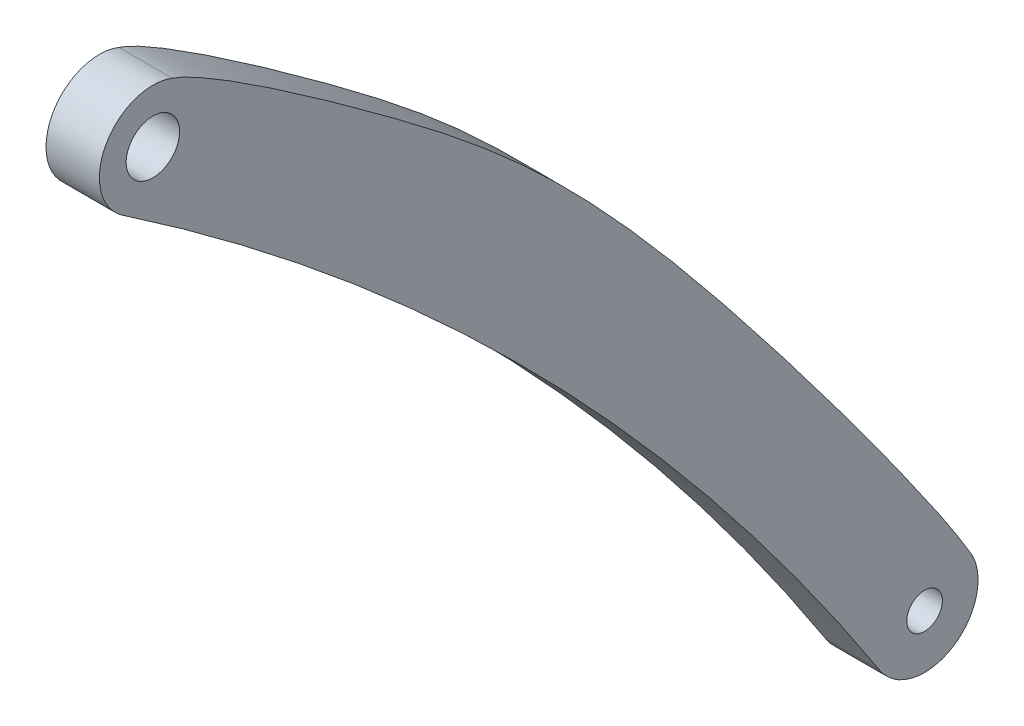
ISO-10303-21;
HEADER;
FILE_DESCRIPTION(('STEP AP214'),'2;1');
FILE_NAME('part.step','',(''),(''),'','','');
FILE_SCHEMA(('AUTOMOTIVE_DESIGN { 1 0 10303 214 1 1 1 1 }'));
ENDSEC;
DATA;
#1=APPLICATION_CONTEXT('core data for automotive mechanical design processes');
#2=APPLICATION_PROTOCOL_DEFINITION('international standard','automotive_design',2000,#1);
#3=PRODUCT_CONTEXT('',#1,'mechanical');
#4=PRODUCT('Part','Part','',(#3));
#5=PRODUCT_RELATED_PRODUCT_CATEGORY('part','',(#4));
#6=PRODUCT_DEFINITION_FORMATION('','',#4);
#7=PRODUCT_DEFINITION_CONTEXT('part definition',#1,'design');
#8=PRODUCT_DEFINITION('design','',#6,#7);
#9=PRODUCT_DEFINITION_SHAPE('','',#8);
#10=(LENGTH_UNIT() NAMED_UNIT(*) SI_UNIT(.MILLI.,.METRE.));
#11=(NAMED_UNIT(*) PLANE_ANGLE_UNIT() SI_UNIT($,.RADIAN.));
#12=(NAMED_UNIT(*) SI_UNIT($,.STERADIAN.) SOLID_ANGLE_UNIT());
#13=UNCERTAINTY_MEASURE_WITH_UNIT(LENGTH_MEASURE(1.E-05),#10,'distance_accuracy_value','');
#14=(GEOMETRIC_REPRESENTATION_CONTEXT(3) GLOBAL_UNCERTAINTY_ASSIGNED_CONTEXT((#13)) GLOBAL_UNIT_ASSIGNED_CONTEXT((#10,
#11,#12)) REPRESENTATION_CONTEXT('',''));
#15=CARTESIAN_POINT('',(0.,0.,0.));
#16=DIRECTION('',(0.,0.,1.));
#17=DIRECTION('',(1.,0.,0.));
#18=AXIS2_PLACEMENT_3D('',#15,#16,#17);
#19=CARTESIAN_POINT('',(4.5,-106.955102548607,-76.1129421232263));
#20=DIRECTION('',(1.,0.,0.));
#21=DIRECTION('',(0.,0.,-1.));
#22=AXIS2_PLACEMENT_3D('',#19,#20,#21);
#23=PLANE('',#22);
#24=CARTESIAN_POINT('',(4.5,149.063106318682,121.853777677032));
#25=DIRECTION('',(1.,0.,0.));
#26=DIRECTION('',(0.,0.,-1.));
#27=AXIS2_PLACEMENT_3D('',#24,#25,#26);
#28=CIRCLE('',#27,2.99999999999999);
#29=CARTESIAN_POINT('',(4.5,149.063106318682,118.853777677032));
#30=VERTEX_POINT('',#29);
#31=EDGE_CURVE('E12',#30,#30,#28,.T.);
#32=ORIENTED_EDGE('',*,*,#31,.F.);
#33=EDGE_LOOP('',(#32));
#34=FACE_BOUND('',#33,.T.);
#35=CARTESIAN_POINT('',(4.5,60.6344164774871,35.2119470582724));
#36=DIRECTION('',(1.,0.,0.));
#37=DIRECTION('',(0.,0.,-1.));
#38=AXIS2_PLACEMENT_3D('',#35,#36,#37);
#39=CIRCLE('',#38,2.);
#40=CARTESIAN_POINT('',(4.5,60.6344164774871,33.2119470582724));
#41=VERTEX_POINT('',#40);
#42=EDGE_CURVE('E59',#41,#41,#39,.T.);
#43=ORIENTED_EDGE('',*,*,#42,.F.);
#44=EDGE_LOOP('',(#43));
#45=FACE_BOUND('',#44,.T.);
#46=CARTESIAN_POINT('',(4.5,57.3746119648548,40.2491759134489));
#47=CARTESIAN_POINT('',(4.5,56.3855919492086,39.609139099006));
#48=CARTESIAN_POINT('',(4.5,55.7116981336144,38.642230444073));
#49=CARTESIAN_POINT('',(4.5,55.0382488465093,37.6759596024477));
#50=CARTESIAN_POINT('',(4.5,54.7800207680061,36.5257396129822));
#51=CARTESIAN_POINT('',(4.5,54.5220226928645,35.3765441227334));
#52=CARTESIAN_POINT('',(4.5,54.7179742299143,34.2140937969478));
#53=CARTESIAN_POINT('',(4.5,54.9137512332307,33.0526788638841));
#54=CARTESIAN_POINT('',(4.5,55.5347751122964,32.0506723238598));
#55=CARTESIAN_POINT('',(4.5,56.1552458464256,31.0495582693945));
#56=CARTESIAN_POINT('',(4.5,57.1090931767279,30.3568367994705));
#57=CARTESIAN_POINT('',(4.5,58.0620909168114,29.6647323353988));
#58=CARTESIAN_POINT('',(4.5,59.2070741384824,29.3841950176238));
#59=CARTESIAN_POINT('',(4.5,60.3510375254185,29.1039075739915));
#60=CARTESIAN_POINT('',(4.5,61.5170771365007,29.2772263267611));
#61=CARTESIAN_POINT('',(4.5,62.6823478818181,29.4504307962302));
#62=CARTESIAN_POINT('',(4.5,63.6959668723814,30.0518202013509));
#63=B_SPLINE_CURVE_WITH_KNOTS('',2,(#46,#47,#48,#49,#50,#51,#52,#53,#54,#55,#56,#57,#58,#59,#60,
#61,#62),.UNSPECIFIED.,.F.,.F.,(3,2,2,2,2,2,2,2,3),(0.,0.125,0.25,0.375,0.5,0.625,0.75,0.875,
1.),.UNSPECIFIED.);
#64=CARTESIAN_POINT('',(4.500006,57.3746119648548,40.2491759134489));
#65=VERTEX_POINT('',#64);
#66=CARTESIAN_POINT('',(4.500006,63.6959668723814,30.0518202013509));
#67=VERTEX_POINT('',#66);
#68=EDGE_CURVE('E100',#65,#67,#63,.T.);
#69=ORIENTED_EDGE('',*,*,#68,.T.);
#70=CARTESIAN_POINT('',(4.500012,154.642181096072,119.646080997619));
#71=CARTESIAN_POINT('',(4.500012,153.494381638237,116.079259200458));
#72=CARTESIAN_POINT('',(4.500012,134.037170486773,87.7637727705401));
#73=CARTESIAN_POINT('',(4.500012,116.169708625814,67.6727740656178));
#74=CARTESIAN_POINT('',(4.500012,71.2688045074131,34.5448539377025));
#75=CARTESIAN_POINT('',(4.500012,63.6959668723814,30.0518202013509));
#76=B_SPLINE_CURVE_WITH_KNOTS('',3,(#70,#71,#72,#73,#74,#75),.UNSPECIFIED.,.F.,.F.,(4,1,1,4),
(0.,0.286961025569847,0.72677294229382,0.944552217218395),.UNSPECIFIED.);
#77=CARTESIAN_POINT('',(4.500006,154.642181096072,119.646080997619));
#78=VERTEX_POINT('',#77);
#79=EDGE_CURVE('E110',#67,#78,#76,.F.);
#80=ORIENTED_EDGE('',*,*,#79,.T.);
#81=CARTESIAN_POINT('',(4.5,154.642181096072,119.646080997619));
#82=CARTESIAN_POINT('',(4.5,155.050035756766,120.676771341787));
#83=CARTESIAN_POINT('',(4.5,155.062719829987,121.785676906353));
#84=CARTESIAN_POINT('',(4.5,155.075394997839,122.893803918743));
#85=CARTESIAN_POINT('',(4.5,154.690855696416,123.934267268791));
#86=CARTESIAN_POINT('',(4.5,154.30668039452,124.973745730775));
#87=CARTESIAN_POINT('',(4.5,153.575702893332,125.80807561149));
#88=CARTESIAN_POINT('',(4.5,152.845417325186,126.64161572725));
#89=CARTESIAN_POINT('',(4.5,151.864545954511,127.159617475481));
#90=CARTESIAN_POINT('',(4.5,150.88460306283,127.677128890569));
#91=CARTESIAN_POINT('',(4.5,149.783387048674,127.810387087594));
#92=CARTESIAN_POINT('',(4.5,148.683213429877,127.943519144313));
#93=CARTESIAN_POINT('',(4.5,147.607096595652,127.674433626875));
#94=CARTESIAN_POINT('',(4.5,146.531998398328,127.405602821963));
#95=CARTESIAN_POINT('',(4.5,145.623109576417,126.769713235317));
#96=CARTESIAN_POINT('',(4.5,144.714858611822,126.134269915381));
#97=CARTESIAN_POINT('',(4.5,144.093462370501,125.215717448698));
#98=B_SPLINE_CURVE_WITH_KNOTS('',2,(#81,#82,#83,#84,#85,#86,#87,#88,#89,#90,#91,#92,#93,#94,#95,
#96,#97),.UNSPECIFIED.,.F.,.F.,(3,2,2,2,2,2,2,2,3),(0.,0.125,0.25,0.375,0.5,0.625,0.75,0.875,
1.),.UNSPECIFIED.);
#99=CARTESIAN_POINT('',(4.500006,144.093462370501,125.215717448698));
#100=VERTEX_POINT('',#99);
#101=EDGE_CURVE('E155',#78,#100,#98,.T.);
#102=ORIENTED_EDGE('',*,*,#101,.T.);
#103=CARTESIAN_POINT('',(4.500012,-107.95465463496,295.725033160249));
#104=DIRECTION('',(1.,0.,0.));
#105=DIRECTION('',(0.,0.543300752105393,-0.839538142529399));
#106=AXIS2_PLACEMENT_3D('',#103,#104,#105);
#107=CIRCLE('',#106,304.305241542797);
#108=EDGE_CURVE('E67',#65,#100,#107,.T.);
#109=ORIENTED_EDGE('',*,*,#108,.F.);
#110=EDGE_LOOP('',(#69,#80,#102,#109));
#111=FACE_BOUND('',#110,.T.);
#112=ADVANCED_FACE('F50',(#34,#45,#111),#23,.T.);
#113=CARTESIAN_POINT('',(-1.5,-106.955102548607,-76.1129421232263));
#114=DIRECTION('',(1.,0.,0.));
#115=DIRECTION('',(0.,0.,-1.));
#116=AXIS2_PLACEMENT_3D('',#113,#114,#115);
#117=PLANE('',#116);
#118=CARTESIAN_POINT('',(-1.5,149.063106318682,121.853777677032));
#119=DIRECTION('',(1.,0.,0.));
#120=DIRECTION('',(0.,0.,-1.));
#121=AXIS2_PLACEMENT_3D('',#118,#119,#120);
#122=CIRCLE('',#121,2.99999999999999);
#123=CARTESIAN_POINT('',(-1.5,149.063106318682,118.853777677032));
#124=VERTEX_POINT('',#123);
#125=EDGE_CURVE('E153',#124,#124,#122,.T.);
#126=ORIENTED_EDGE('',*,*,#125,.T.);
#127=EDGE_LOOP('',(#126));
#128=FACE_BOUND('',#127,.T.);
#129=CARTESIAN_POINT('',(-1.5,60.6344164774871,35.2119470582724));
#130=DIRECTION('',(1.,0.,0.));
#131=DIRECTION('',(0.,0.,-1.));
#132=AXIS2_PLACEMENT_3D('',#129,#130,#131);
#133=CIRCLE('',#132,2.);
#134=CARTESIAN_POINT('',(-1.5,60.6344164774871,33.2119470582724));
#135=VERTEX_POINT('',#134);
#136=EDGE_CURVE('E156',#135,#135,#133,.T.);
#137=ORIENTED_EDGE('',*,*,#136,.T.);
#138=EDGE_LOOP('',(#137));
#139=FACE_BOUND('',#138,.T.);
#140=CARTESIAN_POINT('',(-1.5,63.6959668723814,30.0518202013509));
#141=CARTESIAN_POINT('',(-1.5,71.2688045074131,34.5448539377025));
#142=CARTESIAN_POINT('',(-1.5,116.169708625814,67.6727740656178));
#143=CARTESIAN_POINT('',(-1.5,134.037170486773,87.7637727705401));
#144=CARTESIAN_POINT('',(-1.5,153.634475029742,116.283132843766));
#145=CARTESIAN_POINT('',(-1.5,154.681869057382,119.773633486991));
#146=CARTESIAN_POINT('',(-1.5,154.768335400866,119.996262907293));
#147=B_SPLINE_CURVE_WITH_KNOTS('',3,(#140,#141,#142,#143,#144,#145,#146),.UNSPECIFIED.,.F.,.F.,
(4,1,1,1,4),(0.,0.217779274924575,0.657591191648548,0.944552217218395,0.949785037356246),.UNSPECIFIED.);
#148=CARTESIAN_POINT('',(-1.5,63.6959668723814,30.0518202013509));
#149=VERTEX_POINT('',#148);
#150=CARTESIAN_POINT('',(-1.5,154.642181096072,119.646080997619));
#151=VERTEX_POINT('',#150);
#152=EDGE_CURVE('E216',#149,#151,#147,.T.);
#153=ORIENTED_EDGE('',*,*,#152,.F.);
#154=CARTESIAN_POINT('',(-1.5,60.6344164774871,35.2119470582724));
#155=DIRECTION('',(1.,0.,0.));
#156=DIRECTION('',(0.,0.,-1.));
#157=AXIS2_PLACEMENT_3D('',#154,#155,#156);
#158=CIRCLE('',#157,6.00000000000001);
#159=CARTESIAN_POINT('',(-1.5,57.3746119648548,40.2491759134489));
#160=VERTEX_POINT('',#159);
#161=EDGE_CURVE('E99',#160,#149,#158,.T.);
#162=ORIENTED_EDGE('',*,*,#161,.F.);
#163=CARTESIAN_POINT('',(-1.5,-107.95465463496,295.725033160249));
#164=DIRECTION('',(1.,0.,0.));
#165=DIRECTION('',(0.,0.,-1.));
#166=AXIS2_PLACEMENT_3D('',#163,#164,#165);
#167=CIRCLE('',#166,304.305241542797);
#168=CARTESIAN_POINT('',(-1.5,144.093462370501,125.215717448698));
#169=VERTEX_POINT('',#168);
#170=EDGE_CURVE('E75',#160,#169,#167,.T.);
#171=ORIENTED_EDGE('',*,*,#170,.T.);
#172=CARTESIAN_POINT('',(-1.5,149.063106318682,121.853777677032));
#173=DIRECTION('',(1.,0.,0.));
#174=DIRECTION('',(0.,0.,-1.));
#175=AXIS2_PLACEMENT_3D('',#172,#173,#174);
#176=CIRCLE('',#175,6.00000000000001);
#177=EDGE_CURVE('E102',#151,#169,#176,.T.);
#178=ORIENTED_EDGE('',*,*,#177,.F.);
#179=EDGE_LOOP('',(#153,#162,#171,#178));
#180=FACE_BOUND('',#179,.T.);
#181=ADVANCED_FACE('F133',(#128,#139,#180),#117,.F.);
#182=CARTESIAN_POINT('',(4.5,60.6344164774871,35.2119470582724));
#183=DIRECTION('',(-1.,0.,0.));
#184=DIRECTION('',(0.,0.,1.));
#185=AXIS2_PLACEMENT_3D('',#182,#183,#184);
#186=CYLINDRICAL_SURFACE('',#185,2.);
#187=ORIENTED_EDGE('',*,*,#42,.T.);
#188=EDGE_LOOP('',(#187));
#189=FACE_BOUND('',#188,.T.);
#190=ORIENTED_EDGE('',*,*,#136,.F.);
#191=EDGE_LOOP('',(#190));
#192=FACE_BOUND('',#191,.T.);
#193=ADVANCED_FACE('F47',(#189,#192),#186,.F.);
#194=CARTESIAN_POINT('',(4.5,149.063106318682,121.853777677032));
#195=DIRECTION('',(-1.,0.,0.));
#196=DIRECTION('',(0.,0.,1.));
#197=AXIS2_PLACEMENT_3D('',#194,#195,#196);
#198=CYLINDRICAL_SURFACE('',#197,2.99999999999999);
#199=ORIENTED_EDGE('',*,*,#31,.T.);
#200=EDGE_LOOP('',(#199));
#201=FACE_BOUND('',#200,.T.);
#202=ORIENTED_EDGE('',*,*,#125,.F.);
#203=EDGE_LOOP('',(#202));
#204=FACE_BOUND('',#203,.T.);
#205=ADVANCED_FACE('F232',(#201,#204),#198,.F.);
#206=DIRECTION('',(1.,0.,0.));
#207=VECTOR('',#206,1.);
#208=SURFACE_OF_LINEAR_EXTRUSION('',#147,#207);
#209=DIRECTION('',(1.,0.,0.));
#210=VECTOR('',#209,1.);
#211=CARTESIAN_POINT('',(-1.5,63.6959668723814,30.0518202013509));
#212=LINE('',#211,#210);
#213=EDGE_CURVE('E91',#149,#67,#212,.T.);
#214=ORIENTED_EDGE('',*,*,#213,.F.);
#215=ORIENTED_EDGE('',*,*,#152,.T.);
#216=DIRECTION('',(1.,0.,0.));
#217=VECTOR('',#216,1.);
#218=CARTESIAN_POINT('',(-1.5,154.642181096072,119.646080997619));
#219=LINE('',#218,#217);
#220=EDGE_CURVE('E112',#151,#78,#219,.T.);
#221=ORIENTED_EDGE('',*,*,#220,.T.);
#222=ORIENTED_EDGE('',*,*,#79,.F.);
#223=EDGE_LOOP('',(#214,#215,#221,#222));
#224=FACE_BOUND('',#223,.T.);
#225=ADVANCED_FACE('F108',(#224),#208,.T.);
#226=CARTESIAN_POINT('',(-1.5,149.063106318682,121.853777677032));
#227=DIRECTION('',(1.,0.,0.));
#228=DIRECTION('',(0.,0.,-1.));
#229=AXIS2_PLACEMENT_3D('',#226,#227,#228);
#230=CYLINDRICAL_SURFACE('',#229,6.00000000000001);
#231=ORIENTED_EDGE('',*,*,#220,.F.);
#232=ORIENTED_EDGE('',*,*,#177,.T.);
#233=DIRECTION('',(1.,0.,0.));
#234=VECTOR('',#233,1.);
#235=CARTESIAN_POINT('',(-1.5,144.093462370501,125.215717448698));
#236=LINE('',#235,#234);
#237=EDGE_CURVE('E183',#169,#100,#236,.T.);
#238=ORIENTED_EDGE('',*,*,#237,.T.);
#239=ORIENTED_EDGE('',*,*,#101,.F.);
#240=EDGE_LOOP('',(#231,#232,#238,#239));
#241=FACE_BOUND('',#240,.T.);
#242=ADVANCED_FACE('F167',(#241),#230,.T.);
#243=CARTESIAN_POINT('',(-1.5,-107.95465463496,295.725033160249));
#244=DIRECTION('',(1.,0.,0.));
#245=DIRECTION('',(0.,0.,-1.));
#246=AXIS2_PLACEMENT_3D('',#243,#244,#245);
#247=CYLINDRICAL_SURFACE('',#246,304.305241542797);
#248=ORIENTED_EDGE('',*,*,#237,.F.);
#249=ORIENTED_EDGE('',*,*,#170,.F.);
#250=DIRECTION('',(1.,0.,0.));
#251=VECTOR('',#250,1.);
#252=CARTESIAN_POINT('',(-1.5,57.3746119648548,40.2491759134489));
#253=LINE('',#252,#251);
#254=EDGE_CURVE('E103',#160,#65,#253,.T.);
#255=ORIENTED_EDGE('',*,*,#254,.T.);
#256=ORIENTED_EDGE('',*,*,#108,.T.);
#257=EDGE_LOOP('',(#248,#249,#255,#256));
#258=FACE_BOUND('',#257,.T.);
#259=ADVANCED_FACE('F172',(#258),#247,.F.);
#260=CARTESIAN_POINT('',(-1.5,60.6344164774871,35.2119470582724));
#261=DIRECTION('',(1.,0.,0.));
#262=DIRECTION('',(0.,0.,-1.));
#263=AXIS2_PLACEMENT_3D('',#260,#261,#262);
#264=CYLINDRICAL_SURFACE('',#263,6.00000000000001);
#265=ORIENTED_EDGE('',*,*,#254,.F.);
#266=ORIENTED_EDGE('',*,*,#161,.T.);
#267=ORIENTED_EDGE('',*,*,#213,.T.);
#268=ORIENTED_EDGE('',*,*,#68,.F.);
#269=EDGE_LOOP('',(#265,#266,#267,#268));
#270=FACE_BOUND('',#269,.T.);
#271=ADVANCED_FACE('F92',(#270),#264,.T.);
#272=CLOSED_SHELL('',(#112,#181,#193,#205,#225,#242,#259,#271));
#273=MANIFOLD_SOLID_BREP('B2',#272);
#274=ADVANCED_BREP_SHAPE_REPRESENTATION('',(#18,#273),#14);
#275=SHAPE_DEFINITION_REPRESENTATION(#9,#274);
ENDSEC;
END-ISO-10303-21;
